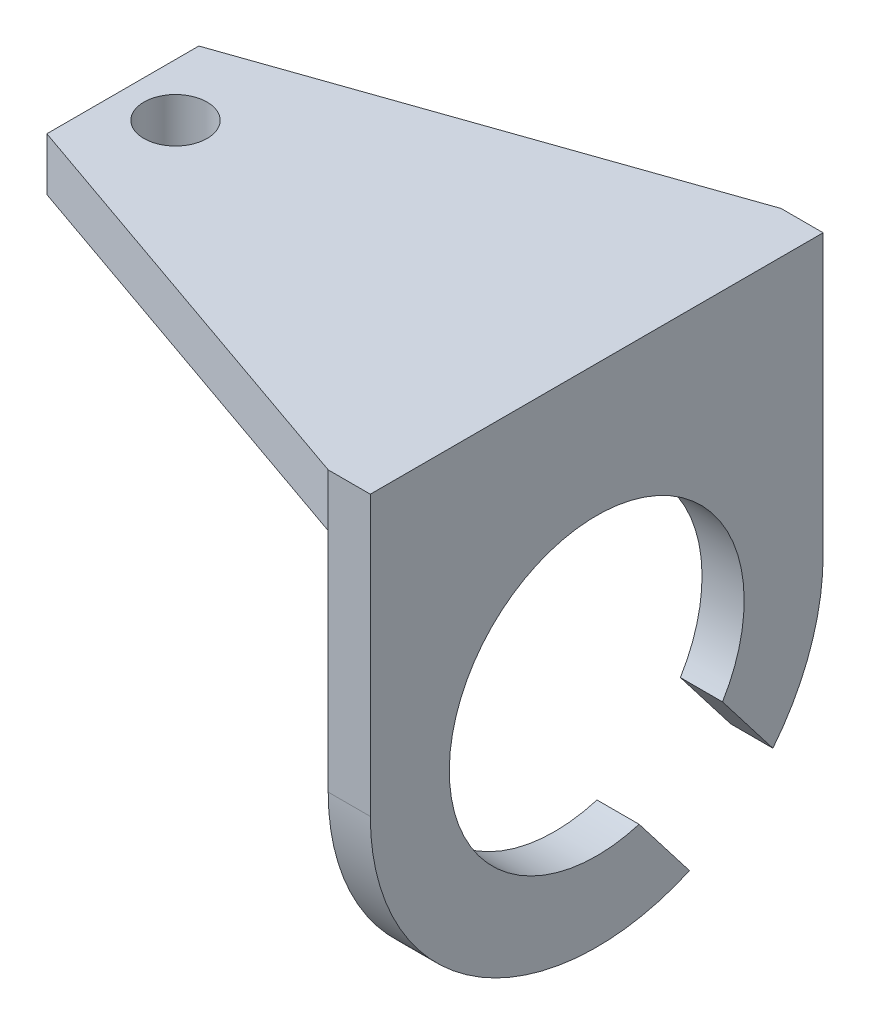
ISO-10303-21;
HEADER;
FILE_DESCRIPTION(('STEP AP214'),'2;1');
FILE_NAME('part.step','',(''),(''),'','','');
FILE_SCHEMA(('AUTOMOTIVE_DESIGN { 1 0 10303 214 1 1 1 1 }'));
ENDSEC;
DATA;
#1=APPLICATION_CONTEXT('core data for automotive mechanical design processes');
#2=APPLICATION_PROTOCOL_DEFINITION('international standard','automotive_design',2000,#1);
#3=PRODUCT_CONTEXT('',#1,'mechanical');
#4=PRODUCT('Part','Part','',(#3));
#5=PRODUCT_RELATED_PRODUCT_CATEGORY('part','',(#4));
#6=PRODUCT_DEFINITION_FORMATION('','',#4);
#7=PRODUCT_DEFINITION_CONTEXT('part definition',#1,'design');
#8=PRODUCT_DEFINITION('design','',#6,#7);
#9=PRODUCT_DEFINITION_SHAPE('','',#8);
#10=(LENGTH_UNIT() NAMED_UNIT(*) SI_UNIT(.MILLI.,.METRE.));
#11=(NAMED_UNIT(*) PLANE_ANGLE_UNIT() SI_UNIT($,.RADIAN.));
#12=(NAMED_UNIT(*) SI_UNIT($,.STERADIAN.) SOLID_ANGLE_UNIT());
#13=UNCERTAINTY_MEASURE_WITH_UNIT(LENGTH_MEASURE(1.E-05),#10,'distance_accuracy_value','');
#14=(GEOMETRIC_REPRESENTATION_CONTEXT(3) GLOBAL_UNCERTAINTY_ASSIGNED_CONTEXT((#13)) GLOBAL_UNIT_ASSIGNED_CONTEXT((#10,
#11,#12)) REPRESENTATION_CONTEXT('',''));
#15=CARTESIAN_POINT('',(0.,0.,0.));
#16=DIRECTION('',(0.,0.,1.));
#17=DIRECTION('',(1.,0.,0.));
#18=AXIS2_PLACEMENT_3D('',#15,#16,#17);
#19=CARTESIAN_POINT('',(4.,0.,0.));
#20=DIRECTION('',(-1.,0.,0.));
#21=DIRECTION('',(0.,0.,1.));
#22=AXIS2_PLACEMENT_3D('',#19,#20,#21);
#23=CYLINDRICAL_SURFACE('',#22,21.5);
#24=CARTESIAN_POINT('',(4.,0.,0.));
#25=DIRECTION('',(1.,0.,0.));
#26=DIRECTION('',(0.,0.,-1.));
#27=AXIS2_PLACEMENT_3D('',#24,#25,#26);
#28=CIRCLE('',#27,21.5);
#29=CARTESIAN_POINT('',(4.,-13.5067349909698,-16.7277646409708));
#30=VERTEX_POINT('',#29);
#31=CARTESIAN_POINT('',(4.,0.,-21.5));
#32=VERTEX_POINT('',#31);
#33=EDGE_CURVE('E143',#30,#32,#28,.T.);
#34=ORIENTED_EDGE('',*,*,#33,.F.);
#35=DIRECTION('',(-1.,0.,0.));
#36=VECTOR('',#35,1.);
#37=CARTESIAN_POINT('',(4.,-13.5067349909698,-16.7277646409708));
#38=LINE('',#37,#36);
#39=CARTESIAN_POINT('',(0.,-13.5067349909698,-16.7277646409708));
#40=VERTEX_POINT('',#39);
#41=EDGE_CURVE('E155',#30,#40,#38,.T.);
#42=ORIENTED_EDGE('',*,*,#41,.T.);
#43=CARTESIAN_POINT('',(0.,0.,0.));
#44=DIRECTION('',(1.,0.,0.));
#45=DIRECTION('',(0.,0.,-1.));
#46=AXIS2_PLACEMENT_3D('',#43,#44,#45);
#47=CIRCLE('',#46,21.5);
#48=CARTESIAN_POINT('',(0.,0.,-21.5));
#49=VERTEX_POINT('',#48);
#50=EDGE_CURVE('E128',#40,#49,#47,.T.);
#51=ORIENTED_EDGE('',*,*,#50,.T.);
#52=DIRECTION('',(-1.,0.,0.));
#53=VECTOR('',#52,1.);
#54=CARTESIAN_POINT('',(4.,0.,-21.5));
#55=LINE('',#54,#53);
#56=EDGE_CURVE('E132',#49,#32,#55,.F.);
#57=ORIENTED_EDGE('',*,*,#56,.T.);
#58=EDGE_LOOP('',(#34,#42,#51,#57));
#59=FACE_BOUND('',#58,.T.);
#60=ADVANCED_FACE('F35',(#59),#23,.T.);
#61=CARTESIAN_POINT('',(0.,-21.501,-21.5));
#62=DIRECTION('',(0.,0.,1.));
#63=DIRECTION('',(1.,0.,0.));
#64=AXIS2_PLACEMENT_3D('',#61,#62,#63);
#65=PLANE('',#64);
#66=DIRECTION('',(0.,-1.,0.));
#67=VECTOR('',#66,1.);
#68=CARTESIAN_POINT('',(0.,26.5,-21.5));
#69=LINE('',#68,#67);
#70=CARTESIAN_POINT('',(0.,26.5,-21.5));
#71=VERTEX_POINT('',#70);
#72=CARTESIAN_POINT('',(0.,21.5,-21.5));
#73=VERTEX_POINT('',#72);
#74=EDGE_CURVE('E165',#71,#73,#69,.T.);
#75=ORIENTED_EDGE('',*,*,#74,.F.);
#76=DIRECTION('',(1.,0.,0.));
#77=VECTOR('',#76,1.);
#78=CARTESIAN_POINT('',(0.,26.5,-21.5));
#79=LINE('',#78,#77);
#80=CARTESIAN_POINT('',(4.,26.5,-21.5));
#81=VERTEX_POINT('',#80);
#82=EDGE_CURVE('E182',#71,#81,#79,.T.);
#83=ORIENTED_EDGE('',*,*,#82,.T.);
#84=DIRECTION('',(0.,1.,0.));
#85=VECTOR('',#84,1.);
#86=CARTESIAN_POINT('',(4.,-21.501,-21.5));
#87=LINE('',#86,#85);
#88=EDGE_CURVE('E211',#32,#81,#87,.T.);
#89=ORIENTED_EDGE('',*,*,#88,.F.);
#90=ORIENTED_EDGE('',*,*,#56,.F.);
#91=DIRECTION('',(0.,1.,0.));
#92=VECTOR('',#91,1.);
#93=CARTESIAN_POINT('',(0.,-21.501,-21.5));
#94=LINE('',#93,#92);
#95=EDGE_CURVE('E136',#49,#73,#94,.T.);
#96=ORIENTED_EDGE('',*,*,#95,.T.);
#97=EDGE_LOOP('',(#75,#83,#89,#90,#96));
#98=FACE_BOUND('',#97,.T.);
#99=ADVANCED_FACE('F239',(#98),#65,.F.);
#100=CARTESIAN_POINT('',(0.,-21.501,21.5));
#101=DIRECTION('',(0.,0.,-1.));
#102=DIRECTION('',(-1.,0.,0.));
#103=AXIS2_PLACEMENT_3D('',#100,#101,#102);
#104=PLANE('',#103);
#105=DIRECTION('',(0.,-1.,0.));
#106=VECTOR('',#105,1.);
#107=CARTESIAN_POINT('',(0.,26.5,21.5));
#108=LINE('',#107,#106);
#109=CARTESIAN_POINT('',(0.,26.5,21.5));
#110=VERTEX_POINT('',#109);
#111=CARTESIAN_POINT('',(0.,21.5,21.5));
#112=VERTEX_POINT('',#111);
#113=EDGE_CURVE('E168',#110,#112,#108,.T.);
#114=ORIENTED_EDGE('',*,*,#113,.T.);
#115=DIRECTION('',(0.,1.,0.));
#116=VECTOR('',#115,1.);
#117=CARTESIAN_POINT('',(0.,-21.501,21.5));
#118=LINE('',#117,#116);
#119=CARTESIAN_POINT('',(0.,0.,21.5));
#120=VERTEX_POINT('',#119);
#121=EDGE_CURVE('E197',#120,#112,#118,.T.);
#122=ORIENTED_EDGE('',*,*,#121,.F.);
#123=DIRECTION('',(-1.,0.,0.));
#124=VECTOR('',#123,1.);
#125=CARTESIAN_POINT('',(4.,0.,21.5));
#126=LINE('',#125,#124);
#127=CARTESIAN_POINT('',(4.,0.,21.5));
#128=VERTEX_POINT('',#127);
#129=EDGE_CURVE('E204',#120,#128,#126,.F.);
#130=ORIENTED_EDGE('',*,*,#129,.T.);
#131=DIRECTION('',(0.,1.,0.));
#132=VECTOR('',#131,1.);
#133=CARTESIAN_POINT('',(4.,-21.501,21.5));
#134=LINE('',#133,#132);
#135=CARTESIAN_POINT('',(4.,26.5,21.5));
#136=VERTEX_POINT('',#135);
#137=EDGE_CURVE('E205',#128,#136,#134,.T.);
#138=ORIENTED_EDGE('',*,*,#137,.T.);
#139=DIRECTION('',(-1.,0.,0.));
#140=VECTOR('',#139,1.);
#141=CARTESIAN_POINT('',(0.,26.5,21.5));
#142=LINE('',#141,#140);
#143=EDGE_CURVE('E188',#136,#110,#142,.T.);
#144=ORIENTED_EDGE('',*,*,#143,.T.);
#145=EDGE_LOOP('',(#114,#122,#130,#138,#144));
#146=FACE_BOUND('',#145,.T.);
#147=ADVANCED_FACE('F228',(#146),#104,.F.);
#148=CARTESIAN_POINT('',(0.,21.5,0.));
#149=DIRECTION('',(0.,1.,0.));
#150=DIRECTION('',(0.,0.,1.));
#151=AXIS2_PLACEMENT_3D('',#148,#149,#150);
#152=PLANE('',#151);
#153=CARTESIAN_POINT('',(-36.,21.5,0.));
#154=DIRECTION('',(0.,1.,0.));
#155=DIRECTION('',(0.,0.,1.));
#156=AXIS2_PLACEMENT_3D('',#153,#154,#155);
#157=CIRCLE('',#156,2.99999999999999);
#158=CARTESIAN_POINT('',(-36.,21.5,2.99999999999999));
#159=VERTEX_POINT('',#158);
#160=EDGE_CURVE('E185',#159,#159,#157,.T.);
#161=ORIENTED_EDGE('',*,*,#160,.T.);
#162=EDGE_LOOP('',(#161));
#163=FACE_BOUND('',#162,.T.);
#164=DIRECTION('',(0.,0.,-1.));
#165=VECTOR('',#164,1.);
#166=CARTESIAN_POINT('',(-41.,21.5,0.));
#167=LINE('',#166,#165);
#168=CARTESIAN_POINT('',(-41.,21.5,7.21600945214452));
#169=VERTEX_POINT('',#168);
#170=CARTESIAN_POINT('',(-41.,21.5,-7.21600945214452));
#171=VERTEX_POINT('',#170);
#172=EDGE_CURVE('E172',#169,#171,#167,.T.);
#173=ORIENTED_EDGE('',*,*,#172,.T.);
#174=DIRECTION('',(-0.944331439204164,0.,0.328995642722806));
#175=VECTOR('',#174,1.);
#176=CARTESIAN_POINT('',(-6.67963996886301,21.5,-19.1728801419923));
#177=LINE('',#176,#175);
#178=EDGE_CURVE('E166',#73,#171,#177,.T.);
#179=ORIENTED_EDGE('',*,*,#178,.F.);
#180=DIRECTION('',(0.,0.,1.));
#181=VECTOR('',#180,1.);
#182=CARTESIAN_POINT('',(0.,21.5,0.));
#183=LINE('',#182,#181);
#184=EDGE_CURVE('E207',#73,#112,#183,.T.);
#185=ORIENTED_EDGE('',*,*,#184,.T.);
#186=DIRECTION('',(-0.944331439204164,0.,-0.328995642722806));
#187=VECTOR('',#186,1.);
#188=CARTESIAN_POINT('',(-6.67963996886301,21.5,19.1728801419923));
#189=LINE('',#188,#187);
#190=EDGE_CURVE('E161',#112,#169,#189,.T.);
#191=ORIENTED_EDGE('',*,*,#190,.T.);
#192=EDGE_LOOP('',(#173,#179,#185,#191));
#193=FACE_BOUND('',#192,.T.);
#194=ADVANCED_FACE('F235',(#163,#193),#152,.F.);
#195=CARTESIAN_POINT('',(-41.,26.5,0.));
#196=DIRECTION('',(-1.,0.,0.));
#197=DIRECTION('',(0.,0.,1.));
#198=AXIS2_PLACEMENT_3D('',#195,#196,#197);
#199=PLANE('',#198);
#200=DIRECTION('',(0.,-1.,0.));
#201=VECTOR('',#200,1.);
#202=CARTESIAN_POINT('',(-41.,26.5,-7.21600945214452));
#203=LINE('',#202,#201);
#204=CARTESIAN_POINT('',(-41.,26.5,-7.21600945214452));
#205=VERTEX_POINT('',#204);
#206=EDGE_CURVE('E169',#205,#171,#203,.T.);
#207=ORIENTED_EDGE('',*,*,#206,.T.);
#208=ORIENTED_EDGE('',*,*,#172,.F.);
#209=DIRECTION('',(0.,-1.,0.));
#210=VECTOR('',#209,1.);
#211=CARTESIAN_POINT('',(-41.,26.5,7.21600945214452));
#212=LINE('',#211,#210);
#213=CARTESIAN_POINT('',(-41.,26.5,7.21600945214452));
#214=VERTEX_POINT('',#213);
#215=EDGE_CURVE('E176',#214,#169,#212,.T.);
#216=ORIENTED_EDGE('',*,*,#215,.F.);
#217=DIRECTION('',(0.,0.,-1.));
#218=VECTOR('',#217,1.);
#219=CARTESIAN_POINT('',(-41.,26.5,0.));
#220=LINE('',#219,#218);
#221=EDGE_CURVE('E184',#214,#205,#220,.T.);
#222=ORIENTED_EDGE('',*,*,#221,.T.);
#223=EDGE_LOOP('',(#207,#208,#216,#222));
#224=FACE_BOUND('',#223,.T.);
#225=ADVANCED_FACE('F260',(#224),#199,.T.);
#226=CARTESIAN_POINT('',(0.,26.5,0.));
#227=DIRECTION('',(0.,1.,0.));
#228=DIRECTION('',(0.,0.,1.));
#229=AXIS2_PLACEMENT_3D('',#226,#227,#228);
#230=PLANE('',#229);
#231=DIRECTION('',(-0.944331439204164,0.,0.328995642722806));
#232=VECTOR('',#231,1.);
#233=CARTESIAN_POINT('',(-6.67963996886301,26.5,-19.1728801419923));
#234=LINE('',#233,#232);
#235=EDGE_CURVE('E162',#71,#205,#234,.T.);
#236=ORIENTED_EDGE('',*,*,#235,.T.);
#237=ORIENTED_EDGE('',*,*,#221,.F.);
#238=DIRECTION('',(-0.944331439204164,0.,-0.328995642722806));
#239=VECTOR('',#238,1.);
#240=CARTESIAN_POINT('',(-6.67963996886301,26.5,19.1728801419923));
#241=LINE('',#240,#239);
#242=EDGE_CURVE('E174',#110,#214,#241,.T.);
#243=ORIENTED_EDGE('',*,*,#242,.F.);
#244=ORIENTED_EDGE('',*,*,#143,.F.);
#245=DIRECTION('',(0.,0.,-1.));
#246=VECTOR('',#245,1.);
#247=CARTESIAN_POINT('',(4.,26.5,0.));
#248=LINE('',#247,#246);
#249=EDGE_CURVE('E191',#136,#81,#248,.T.);
#250=ORIENTED_EDGE('',*,*,#249,.T.);
#251=ORIENTED_EDGE('',*,*,#82,.F.);
#252=EDGE_LOOP('',(#236,#237,#243,#244,#250,#251));
#253=FACE_BOUND('',#252,.T.);
#254=CARTESIAN_POINT('',(-36.,26.5,0.));
#255=DIRECTION('',(0.,1.,0.));
#256=DIRECTION('',(0.,0.,1.));
#257=AXIS2_PLACEMENT_3D('',#254,#255,#256);
#258=CIRCLE('',#257,2.99999999999999);
#259=CARTESIAN_POINT('',(-36.,26.5,2.99999999999999));
#260=VERTEX_POINT('',#259);
#261=EDGE_CURVE('E194',#260,#260,#258,.T.);
#262=ORIENTED_EDGE('',*,*,#261,.F.);
#263=EDGE_LOOP('',(#262));
#264=FACE_BOUND('',#263,.T.);
#265=ADVANCED_FACE('F223',(#253,#264),#230,.T.);
#266=CARTESIAN_POINT('',(4.,0.,0.));
#267=DIRECTION('',(1.,0.,0.));
#268=DIRECTION('',(0.,0.,-1.));
#269=AXIS2_PLACEMENT_3D('',#266,#267,#268);
#270=PLANE('',#269);
#271=DIRECTION('',(0.,-0.791934504896329,-0.610606043169084));
#272=VECTOR('',#271,1.);
#273=CARTESIAN_POINT('',(4.,-20.7050049310445,-22.2778538195542));
#274=LINE('',#273,#272);
#275=CARTESIAN_POINT('',(4.,-7.30285721439263,-11.9443826339495));
#276=VERTEX_POINT('',#275);
#277=EDGE_CURVE('E57',#276,#30,#274,.T.);
#278=ORIENTED_EDGE('',*,*,#277,.T.);
#279=ORIENTED_EDGE('',*,*,#33,.T.);
#280=ORIENTED_EDGE('',*,*,#88,.T.);
#281=ORIENTED_EDGE('',*,*,#249,.F.);
#282=ORIENTED_EDGE('',*,*,#137,.F.);
#283=CARTESIAN_POINT('',(4.,-19.6127954226607,-8.80841959200746));
#284=VERTEX_POINT('',#283);
#285=EDGE_CURVE('E140',#128,#284,#28,.T.);
#286=ORIENTED_EDGE('',*,*,#285,.T.);
#287=DIRECTION('',(0.,0.791934504896329,0.610606043169084));
#288=VECTOR('',#287,1.);
#289=CARTESIAN_POINT('',(4.,-3.05303021584542,3.95967252448165));
#290=LINE('',#289,#288);
#291=CARTESIAN_POINT('',(4.,-13.4089176460835,-4.02503758498617));
#292=VERTEX_POINT('',#291);
#293=EDGE_CURVE('E148',#284,#292,#290,.T.);
#294=ORIENTED_EDGE('',*,*,#293,.T.);
#295=CARTESIAN_POINT('',(4.,0.,0.));
#296=DIRECTION('',(1.,0.,0.));
#297=DIRECTION('',(0.,0.,-1.));
#298=AXIS2_PLACEMENT_3D('',#295,#296,#297);
#299=CIRCLE('',#298,14.);
#300=EDGE_CURVE('E131',#276,#292,#299,.T.);
#301=ORIENTED_EDGE('',*,*,#300,.F.);
#302=EDGE_LOOP('',(#278,#279,#280,#281,#282,#286,#294,#301));
#303=FACE_BOUND('',#302,.T.);
#304=ADVANCED_FACE('F151',(#303),#270,.T.);
#305=CARTESIAN_POINT('',(0.,0.,0.));
#306=DIRECTION('',(1.,0.,0.));
#307=DIRECTION('',(0.,0.,-1.));
#308=AXIS2_PLACEMENT_3D('',#305,#306,#307);
#309=PLANE('',#308);
#310=ORIENTED_EDGE('',*,*,#50,.F.);
#311=DIRECTION('',(0.,-0.791934504896329,-0.610606043169084));
#312=VECTOR('',#311,1.);
#313=CARTESIAN_POINT('',(0.,-20.7050049310445,-22.2778538195542));
#314=LINE('',#313,#312);
#315=CARTESIAN_POINT('',(0.,-7.30285721439263,-11.9443826339495));
#316=VERTEX_POINT('',#315);
#317=EDGE_CURVE('E116',#316,#40,#314,.T.);
#318=ORIENTED_EDGE('',*,*,#317,.F.);
#319=CARTESIAN_POINT('',(0.,0.,0.));
#320=DIRECTION('',(1.,0.,0.));
#321=DIRECTION('',(0.,0.,-1.));
#322=AXIS2_PLACEMENT_3D('',#319,#320,#321);
#323=CIRCLE('',#322,14.);
#324=CARTESIAN_POINT('',(0.,-13.4089176460835,-4.02503758498617));
#325=VERTEX_POINT('',#324);
#326=EDGE_CURVE('E126',#316,#325,#323,.T.);
#327=ORIENTED_EDGE('',*,*,#326,.T.);
#328=DIRECTION('',(0.,0.791934504896329,0.610606043169084));
#329=VECTOR('',#328,1.);
#330=CARTESIAN_POINT('',(0.,-3.05303021584542,3.95967252448165));
#331=LINE('',#330,#329);
#332=CARTESIAN_POINT('',(0.,-19.6127954226607,-8.80841959200746));
#333=VERTEX_POINT('',#332);
#334=EDGE_CURVE('E50',#333,#325,#331,.T.);
#335=ORIENTED_EDGE('',*,*,#334,.F.);
#336=EDGE_CURVE('E144',#120,#333,#47,.T.);
#337=ORIENTED_EDGE('',*,*,#336,.F.);
#338=ORIENTED_EDGE('',*,*,#121,.T.);
#339=ORIENTED_EDGE('',*,*,#184,.F.);
#340=ORIENTED_EDGE('',*,*,#95,.F.);
#341=EDGE_LOOP('',(#310,#318,#327,#335,#337,#338,#339,#340));
#342=FACE_BOUND('',#341,.T.);
#343=ADVANCED_FACE('F125',(#342),#309,.F.);
#344=ORIENTED_EDGE('',*,*,#336,.T.);
#345=DIRECTION('',(-1.,0.,0.));
#346=VECTOR('',#345,1.);
#347=CARTESIAN_POINT('',(4.,-19.6127954226607,-8.80841959200746));
#348=LINE('',#347,#346);
#349=EDGE_CURVE('E153',#333,#284,#348,.F.);
#350=ORIENTED_EDGE('',*,*,#349,.T.);
#351=ORIENTED_EDGE('',*,*,#285,.F.);
#352=ORIENTED_EDGE('',*,*,#129,.F.);
#353=EDGE_LOOP('',(#344,#350,#351,#352));
#354=FACE_BOUND('',#353,.T.);
#355=ADVANCED_FACE('F37',(#354),#23,.T.);
#356=CARTESIAN_POINT('',(4.,0.,0.));
#357=DIRECTION('',(-1.,0.,0.));
#358=DIRECTION('',(0.,0.,1.));
#359=AXIS2_PLACEMENT_3D('',#356,#357,#358);
#360=CYLINDRICAL_SURFACE('',#359,14.);
#361=DIRECTION('',(-1.,0.,0.));
#362=VECTOR('',#361,1.);
#363=CARTESIAN_POINT('',(4.,-7.30285721439263,-11.9443826339495));
#364=LINE('',#363,#362);
#365=EDGE_CURVE('E11',#276,#316,#364,.T.);
#366=ORIENTED_EDGE('',*,*,#365,.F.);
#367=ORIENTED_EDGE('',*,*,#300,.T.);
#368=DIRECTION('',(-1.,0.,0.));
#369=VECTOR('',#368,1.);
#370=CARTESIAN_POINT('',(4.,-13.4089176460835,-4.02503758498617));
#371=LINE('',#370,#369);
#372=EDGE_CURVE('E43',#325,#292,#371,.F.);
#373=ORIENTED_EDGE('',*,*,#372,.F.);
#374=ORIENTED_EDGE('',*,*,#326,.F.);
#375=EDGE_LOOP('',(#366,#367,#373,#374));
#376=FACE_BOUND('',#375,.T.);
#377=ADVANCED_FACE('F130',(#376),#360,.F.);
#378=CARTESIAN_POINT('',(-36.,26.5,0.));
#379=DIRECTION('',(0.,-1.,0.));
#380=DIRECTION('',(0.,0.,-1.));
#381=AXIS2_PLACEMENT_3D('',#378,#379,#380);
#382=CYLINDRICAL_SURFACE('',#381,2.99999999999999);
#383=ORIENTED_EDGE('',*,*,#261,.T.);
#384=EDGE_LOOP('',(#383));
#385=FACE_BOUND('',#384,.T.);
#386=ORIENTED_EDGE('',*,*,#160,.F.);
#387=EDGE_LOOP('',(#386));
#388=FACE_BOUND('',#387,.T.);
#389=ADVANCED_FACE('F251',(#385,#388),#382,.F.);
#390=CARTESIAN_POINT('',(-6.67963996886301,26.5,19.1728801419923));
#391=DIRECTION('',(-0.328995642722806,0.,0.944331439204164));
#392=DIRECTION('',(0.944331439204164,0.,0.328995642722806));
#393=AXIS2_PLACEMENT_3D('',#390,#391,#392);
#394=PLANE('',#393);
#395=ORIENTED_EDGE('',*,*,#190,.F.);
#396=ORIENTED_EDGE('',*,*,#113,.F.);
#397=ORIENTED_EDGE('',*,*,#242,.T.);
#398=ORIENTED_EDGE('',*,*,#215,.T.);
#399=EDGE_LOOP('',(#395,#396,#397,#398));
#400=FACE_BOUND('',#399,.T.);
#401=ADVANCED_FACE('F266',(#400),#394,.T.);
#402=CARTESIAN_POINT('',(-6.67963996886301,26.5,-19.1728801419923));
#403=DIRECTION('',(0.328995642722806,0.,0.944331439204164));
#404=DIRECTION('',(0.944331439204164,0.,-0.328995642722806));
#405=AXIS2_PLACEMENT_3D('',#402,#403,#404);
#406=PLANE('',#405);
#407=ORIENTED_EDGE('',*,*,#178,.T.);
#408=ORIENTED_EDGE('',*,*,#206,.F.);
#409=ORIENTED_EDGE('',*,*,#235,.F.);
#410=ORIENTED_EDGE('',*,*,#74,.T.);
#411=EDGE_LOOP('',(#407,#408,#409,#410));
#412=FACE_BOUND('',#411,.T.);
#413=ADVANCED_FACE('F275',(#412),#406,.F.);
#414=CARTESIAN_POINT('',(4.,-3.05303021584542,3.95967252448165));
#415=DIRECTION('',(0.,-0.610606043169084,0.79193450489633));
#416=DIRECTION('',(0.,-0.79193450489633,-0.610606043169084));
#417=AXIS2_PLACEMENT_3D('',#414,#415,#416);
#418=PLANE('',#417);
#419=ORIENTED_EDGE('',*,*,#334,.T.);
#420=ORIENTED_EDGE('',*,*,#372,.T.);
#421=ORIENTED_EDGE('',*,*,#293,.F.);
#422=ORIENTED_EDGE('',*,*,#349,.F.);
#423=EDGE_LOOP('',(#419,#420,#421,#422));
#424=FACE_BOUND('',#423,.T.);
#425=ADVANCED_FACE('F147',(#424),#418,.F.);
#426=CARTESIAN_POINT('',(4.,-20.7050049310445,-22.2778538195542));
#427=DIRECTION('',(0.,0.610606043169084,-0.791934504896329));
#428=DIRECTION('',(0.,0.791934504896329,0.610606043169084));
#429=AXIS2_PLACEMENT_3D('',#426,#427,#428);
#430=PLANE('',#429);
#431=ORIENTED_EDGE('',*,*,#277,.F.);
#432=ORIENTED_EDGE('',*,*,#365,.T.);
#433=ORIENTED_EDGE('',*,*,#317,.T.);
#434=ORIENTED_EDGE('',*,*,#41,.F.);
#435=EDGE_LOOP('',(#431,#432,#433,#434));
#436=FACE_BOUND('',#435,.T.);
#437=ADVANCED_FACE('F115',(#436),#430,.F.);
#438=CLOSED_SHELL('',(#60,#99,#147,#194,#225,#265,#304,#343,#355,#377,#389,#401,#413,#425,#437));
#439=MANIFOLD_SOLID_BREP('B2',#438);
#440=ADVANCED_BREP_SHAPE_REPRESENTATION('',(#18,#439),#14);
#441=SHAPE_DEFINITION_REPRESENTATION(#9,#440);
ENDSEC;
END-ISO-10303-21;
